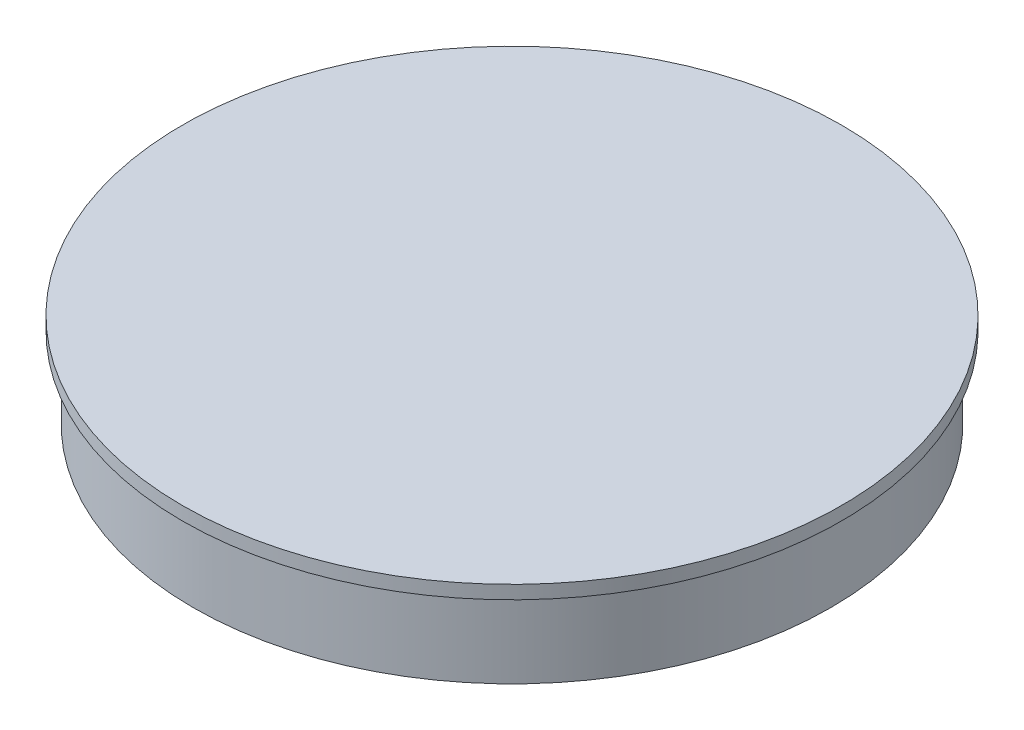
ISO-10303-21;
HEADER;
FILE_DESCRIPTION(('STEP AP214'),'2;1');
FILE_NAME('part.step','',(''),(''),'','','');
FILE_SCHEMA(('AUTOMOTIVE_DESIGN { 1 0 10303 214 1 1 1 1 }'));
ENDSEC;
DATA;
#1=APPLICATION_CONTEXT('core data for automotive mechanical design processes');
#2=APPLICATION_PROTOCOL_DEFINITION('international standard','automotive_design',2000,#1);
#3=PRODUCT_CONTEXT('',#1,'mechanical');
#4=PRODUCT('Part','Part','',(#3));
#5=PRODUCT_RELATED_PRODUCT_CATEGORY('part','',(#4));
#6=PRODUCT_DEFINITION_FORMATION('','',#4);
#7=PRODUCT_DEFINITION_CONTEXT('part definition',#1,'design');
#8=PRODUCT_DEFINITION('design','',#6,#7);
#9=PRODUCT_DEFINITION_SHAPE('','',#8);
#10=(LENGTH_UNIT() NAMED_UNIT(*) SI_UNIT(.MILLI.,.METRE.));
#11=(NAMED_UNIT(*) PLANE_ANGLE_UNIT() SI_UNIT($,.RADIAN.));
#12=(NAMED_UNIT(*) SI_UNIT($,.STERADIAN.) SOLID_ANGLE_UNIT());
#13=UNCERTAINTY_MEASURE_WITH_UNIT(LENGTH_MEASURE(1.E-05),#10,'distance_accuracy_value','');
#14=(GEOMETRIC_REPRESENTATION_CONTEXT(3) GLOBAL_UNCERTAINTY_ASSIGNED_CONTEXT((#13)) GLOBAL_UNIT_ASSIGNED_CONTEXT((#10,
#11,#12)) REPRESENTATION_CONTEXT('',''));
#15=CARTESIAN_POINT('',(0.,0.,0.));
#16=DIRECTION('',(0.,0.,1.));
#17=DIRECTION('',(1.,0.,0.));
#18=AXIS2_PLACEMENT_3D('',#15,#16,#17);
#19=CARTESIAN_POINT('',(0.,0.,0.));
#20=DIRECTION('',(0.,1.,0.));
#21=DIRECTION('',(0.,0.,1.));
#22=AXIS2_PLACEMENT_3D('',#19,#20,#21);
#23=PLANE('',#22);
#24=CARTESIAN_POINT('',(0.,0.,0.));
#25=DIRECTION('',(0.,1.,0.));
#26=DIRECTION('',(0.,0.,1.));
#27=AXIS2_PLACEMENT_3D('',#24,#25,#26);
#28=CIRCLE('',#27,35.7);
#29=CARTESIAN_POINT('',(0.,0.,35.7));
#30=VERTEX_POINT('',#29);
#31=EDGE_CURVE('E35',#30,#30,#28,.T.);
#32=ORIENTED_EDGE('',*,*,#31,.F.);
#33=EDGE_LOOP('',(#32));
#34=FACE_BOUND('',#33,.T.);
#35=CARTESIAN_POINT('',(0.,0.,0.));
#36=DIRECTION('',(0.,1.,0.));
#37=DIRECTION('',(0.,0.,1.));
#38=AXIS2_PLACEMENT_3D('',#35,#36,#37);
#39=CIRCLE('',#38,34.7);
#40=CARTESIAN_POINT('',(0.,0.,34.7));
#41=VERTEX_POINT('',#40);
#42=EDGE_CURVE('E42',#41,#41,#39,.T.);
#43=ORIENTED_EDGE('',*,*,#42,.T.);
#44=EDGE_LOOP('',(#43));
#45=FACE_BOUND('',#44,.T.);
#46=ADVANCED_FACE('F31',(#34,#45),#23,.F.);
#47=CARTESIAN_POINT('',(0.,9.,0.));
#48=DIRECTION('',(0.,-1.,0.));
#49=DIRECTION('',(0.,0.,-1.));
#50=AXIS2_PLACEMENT_3D('',#47,#48,#49);
#51=CYLINDRICAL_SURFACE('',#50,35.7);
#52=CARTESIAN_POINT('',(0.,9.,0.));
#53=DIRECTION('',(0.,1.,0.));
#54=DIRECTION('',(0.,0.,1.));
#55=AXIS2_PLACEMENT_3D('',#52,#53,#54);
#56=CIRCLE('',#55,35.7);
#57=CARTESIAN_POINT('',(0.,9.,35.7));
#58=VERTEX_POINT('',#57);
#59=EDGE_CURVE('E10',#58,#58,#56,.T.);
#60=ORIENTED_EDGE('',*,*,#59,.F.);
#61=EDGE_LOOP('',(#60));
#62=FACE_BOUND('',#61,.T.);
#63=ORIENTED_EDGE('',*,*,#31,.T.);
#64=EDGE_LOOP('',(#63));
#65=FACE_BOUND('',#64,.T.);
#66=ADVANCED_FACE('F33',(#62,#65),#51,.T.);
#67=CARTESIAN_POINT('',(0.,9.,0.));
#68=DIRECTION('',(0.,-1.,0.));
#69=DIRECTION('',(0.,0.,-1.));
#70=AXIS2_PLACEMENT_3D('',#67,#68,#69);
#71=CYLINDRICAL_SURFACE('',#70,34.7);
#72=CARTESIAN_POINT('',(0.,9.,0.));
#73=DIRECTION('',(0.,1.,0.));
#74=DIRECTION('',(0.,0.,1.));
#75=AXIS2_PLACEMENT_3D('',#72,#73,#74);
#76=CIRCLE('',#75,34.7);
#77=CARTESIAN_POINT('',(0.,9.,34.7));
#78=VERTEX_POINT('',#77);
#79=EDGE_CURVE('E46',#78,#78,#76,.T.);
#80=ORIENTED_EDGE('',*,*,#79,.T.);
#81=EDGE_LOOP('',(#80));
#82=FACE_BOUND('',#81,.T.);
#83=ORIENTED_EDGE('',*,*,#42,.F.);
#84=EDGE_LOOP('',(#83));
#85=FACE_BOUND('',#84,.T.);
#86=ADVANCED_FACE('F73',(#82,#85),#71,.F.);
#87=CARTESIAN_POINT('',(0.,9.,0.));
#88=DIRECTION('',(0.,1.,0.));
#89=DIRECTION('',(0.,0.,1.));
#90=AXIS2_PLACEMENT_3D('',#87,#88,#89);
#91=PLANE('',#90);
#92=ORIENTED_EDGE('',*,*,#79,.F.);
#93=EDGE_LOOP('',(#92));
#94=FACE_BOUND('',#93,.T.);
#95=ADVANCED_FACE('F61',(#94),#91,.F.);
#96=CARTESIAN_POINT('',(0.,10.5,0.));
#97=DIRECTION('',(0.,-1.,0.));
#98=DIRECTION('',(0.,0.,-1.));
#99=AXIS2_PLACEMENT_3D('',#96,#97,#98);
#100=CYLINDRICAL_SURFACE('',#99,36.9);
#101=CARTESIAN_POINT('',(0.,10.5,0.));
#102=DIRECTION('',(0.,1.,0.));
#103=DIRECTION('',(0.,0.,1.));
#104=AXIS2_PLACEMENT_3D('',#101,#102,#103);
#105=CIRCLE('',#104,36.9);
#106=CARTESIAN_POINT('',(0.,10.5,36.9));
#107=VERTEX_POINT('',#106);
#108=EDGE_CURVE('E49',#107,#107,#105,.T.);
#109=ORIENTED_EDGE('',*,*,#108,.F.);
#110=EDGE_LOOP('',(#109));
#111=FACE_BOUND('',#110,.T.);
#112=CARTESIAN_POINT('',(0.,9.,0.));
#113=DIRECTION('',(0.,1.,0.));
#114=DIRECTION('',(0.,0.,1.));
#115=AXIS2_PLACEMENT_3D('',#112,#113,#114);
#116=CIRCLE('',#115,36.9);
#117=CARTESIAN_POINT('',(0.,9.,36.9));
#118=VERTEX_POINT('',#117);
#119=EDGE_CURVE('E50',#118,#118,#116,.T.);
#120=ORIENTED_EDGE('',*,*,#119,.T.);
#121=EDGE_LOOP('',(#120));
#122=FACE_BOUND('',#121,.T.);
#123=ADVANCED_FACE('F58',(#111,#122),#100,.T.);
#124=CARTESIAN_POINT('',(0.,10.5,0.));
#125=DIRECTION('',(0.,1.,0.));
#126=DIRECTION('',(0.,0.,1.));
#127=AXIS2_PLACEMENT_3D('',#124,#125,#126);
#128=PLANE('',#127);
#129=ORIENTED_EDGE('',*,*,#108,.T.);
#130=EDGE_LOOP('',(#129));
#131=FACE_BOUND('',#130,.T.);
#132=ADVANCED_FACE('F56',(#131),#128,.T.);
#133=ORIENTED_EDGE('',*,*,#59,.T.);
#134=EDGE_LOOP('',(#133));
#135=FACE_BOUND('',#134,.T.);
#136=ORIENTED_EDGE('',*,*,#119,.F.);
#137=EDGE_LOOP('',(#136));
#138=FACE_BOUND('',#137,.T.);
#139=ADVANCED_FACE('F65',(#135,#138),#91,.F.);
#140=CLOSED_SHELL('',(#46,#66,#86,#95,#123,#132,#139));
#141=MANIFOLD_SOLID_BREP('B2',#140);
#142=ADVANCED_BREP_SHAPE_REPRESENTATION('',(#18,#141),#14);
#143=SHAPE_DEFINITION_REPRESENTATION(#9,#142);
ENDSEC;
END-ISO-10303-21;
